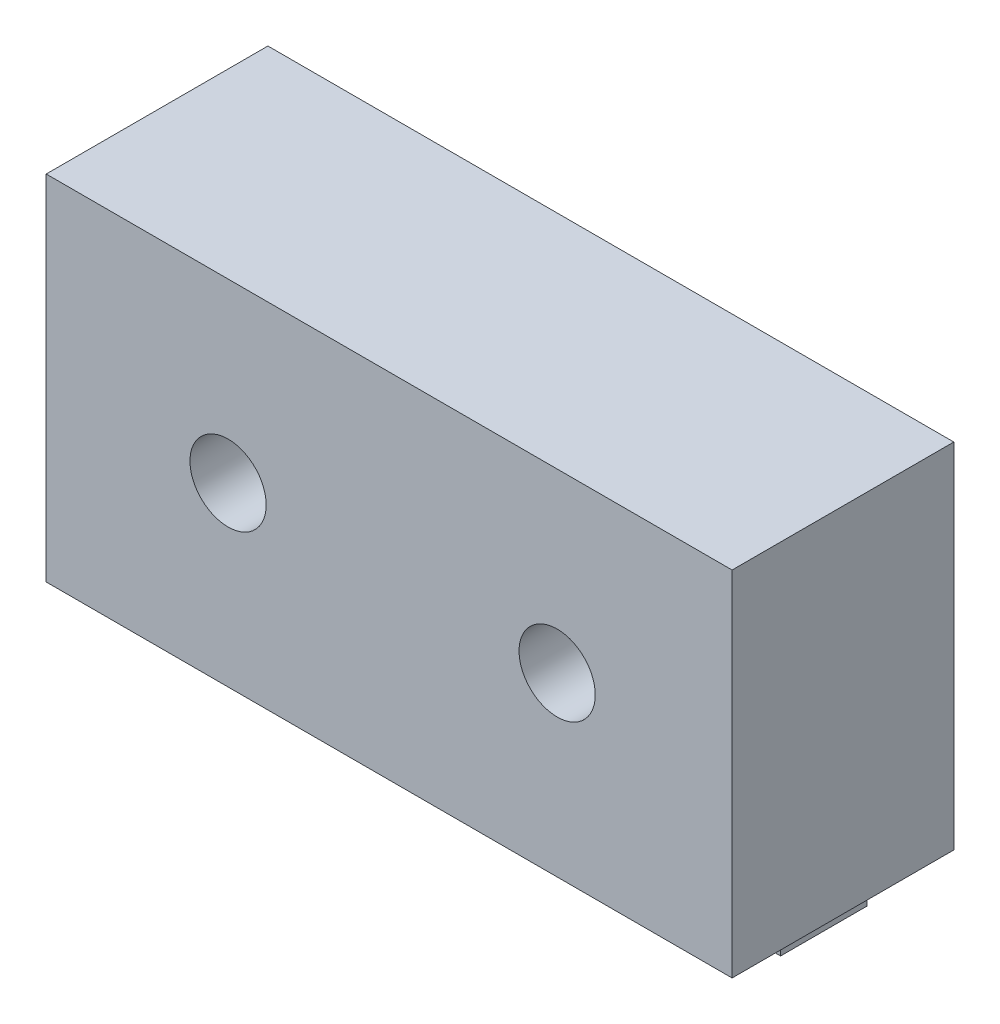
ISO-10303-21;
HEADER;
FILE_DESCRIPTION(('STEP AP214'),'2;1');
FILE_NAME('part.step','',(''),(''),'','','');
FILE_SCHEMA(('AUTOMOTIVE_DESIGN { 1 0 10303 214 1 1 1 1 }'));
ENDSEC;
DATA;
#1=APPLICATION_CONTEXT('core data for automotive mechanical design processes');
#2=APPLICATION_PROTOCOL_DEFINITION('international standard','automotive_design',2000,#1);
#3=PRODUCT_CONTEXT('',#1,'mechanical');
#4=PRODUCT('Part','Part','',(#3));
#5=PRODUCT_RELATED_PRODUCT_CATEGORY('part','',(#4));
#6=PRODUCT_DEFINITION_FORMATION('','',#4);
#7=PRODUCT_DEFINITION_CONTEXT('part definition',#1,'design');
#8=PRODUCT_DEFINITION('design','',#6,#7);
#9=PRODUCT_DEFINITION_SHAPE('','',#8);
#10=(LENGTH_UNIT() NAMED_UNIT(*) SI_UNIT(.MILLI.,.METRE.));
#11=(NAMED_UNIT(*) PLANE_ANGLE_UNIT() SI_UNIT($,.RADIAN.));
#12=(NAMED_UNIT(*) SI_UNIT($,.STERADIAN.) SOLID_ANGLE_UNIT());
#13=UNCERTAINTY_MEASURE_WITH_UNIT(LENGTH_MEASURE(1.E-05),#10,'distance_accuracy_value','');
#14=(GEOMETRIC_REPRESENTATION_CONTEXT(3) GLOBAL_UNCERTAINTY_ASSIGNED_CONTEXT((#13)) GLOBAL_UNIT_ASSIGNED_CONTEXT((#10,
#11,#12)) REPRESENTATION_CONTEXT('',''));
#15=CARTESIAN_POINT('',(0.,0.,0.));
#16=DIRECTION('',(0.,0.,1.));
#17=DIRECTION('',(1.,0.,0.));
#18=AXIS2_PLACEMENT_3D('',#15,#16,#17);
#19=CARTESIAN_POINT('',(-866.,160.7,20.));
#20=DIRECTION('',(1.,0.,0.));
#21=DIRECTION('',(0.,0.,-1.));
#22=AXIS2_PLACEMENT_3D('',#19,#20,#21);
#23=PLANE('',#22);
#24=DIRECTION('',(0.,-1.,0.));
#25=VECTOR('',#24,1.);
#26=CARTESIAN_POINT('',(-866.,160.7,13.6));
#27=LINE('',#26,#25);
#28=CARTESIAN_POINT('',(-866.,160.7,13.6));
#29=VERTEX_POINT('',#28);
#30=CARTESIAN_POINT('',(-866.,150.5,13.6));
#31=VERTEX_POINT('',#30);
#32=EDGE_CURVE('E153',#29,#31,#27,.T.);
#33=ORIENTED_EDGE('',*,*,#32,.T.);
#34=DIRECTION('',(0.,0.,-1.));
#35=VECTOR('',#34,1.);
#36=CARTESIAN_POINT('',(-866.,150.5,20.));
#37=LINE('',#36,#35);
#38=CARTESIAN_POINT('',(-866.,150.5,20.));
#39=VERTEX_POINT('',#38);
#40=EDGE_CURVE('E11',#39,#31,#37,.T.);
#41=ORIENTED_EDGE('',*,*,#40,.F.);
#42=DIRECTION('',(0.,-1.,0.));
#43=VECTOR('',#42,1.);
#44=CARTESIAN_POINT('',(-866.,160.7,20.));
#45=LINE('',#44,#43);
#46=CARTESIAN_POINT('',(-866.,160.7,20.));
#47=VERTEX_POINT('',#46);
#48=EDGE_CURVE('E152',#47,#39,#45,.T.);
#49=ORIENTED_EDGE('',*,*,#48,.F.);
#50=DIRECTION('',(0.,0.,-1.));
#51=VECTOR('',#50,1.);
#52=CARTESIAN_POINT('',(-866.,160.7,20.));
#53=LINE('',#52,#51);
#54=EDGE_CURVE('E159',#47,#29,#53,.T.);
#55=ORIENTED_EDGE('',*,*,#54,.T.);
#56=EDGE_LOOP('',(#33,#41,#49,#55));
#57=FACE_BOUND('',#56,.T.);
#58=ADVANCED_FACE('F41',(#57),#23,.F.);
#59=CARTESIAN_POINT('',(-866.,150.5,20.));
#60=DIRECTION('',(0.,1.,0.));
#61=DIRECTION('',(0.,0.,1.));
#62=AXIS2_PLACEMENT_3D('',#59,#60,#61);
#63=PLANE('',#62);
#64=DIRECTION('',(0.,0.,-1.));
#65=VECTOR('',#64,1.);
#66=CARTESIAN_POINT('',(-846.75,150.5,18.05));
#67=LINE('',#66,#65);
#68=CARTESIAN_POINT('',(-846.75,150.5,18.05));
#69=VERTEX_POINT('',#68);
#70=CARTESIAN_POINT('',(-846.75,150.5,15.55));
#71=VERTEX_POINT('',#70);
#72=EDGE_CURVE('E145',#69,#71,#67,.T.);
#73=ORIENTED_EDGE('',*,*,#72,.T.);
#74=DIRECTION('',(-1.,0.,0.));
#75=VECTOR('',#74,1.);
#76=CARTESIAN_POINT('',(-846.75,150.5,15.55));
#77=LINE('',#76,#75);
#78=CARTESIAN_POINT('',(-849.25,150.5,15.55));
#79=VERTEX_POINT('',#78);
#80=EDGE_CURVE('E60',#71,#79,#77,.T.);
#81=ORIENTED_EDGE('',*,*,#80,.T.);
#82=DIRECTION('',(0.,0.,-1.));
#83=VECTOR('',#82,1.);
#84=CARTESIAN_POINT('',(-849.25,150.5,18.05));
#85=LINE('',#84,#83);
#86=CARTESIAN_POINT('',(-849.25,150.5,18.05));
#87=VERTEX_POINT('',#86);
#88=EDGE_CURVE('E208',#87,#79,#85,.T.);
#89=ORIENTED_EDGE('',*,*,#88,.F.);
#90=DIRECTION('',(-1.,0.,0.));
#91=VECTOR('',#90,1.);
#92=CARTESIAN_POINT('',(-846.75,150.5,18.05));
#93=LINE('',#92,#91);
#94=EDGE_CURVE('E131',#69,#87,#93,.T.);
#95=ORIENTED_EDGE('',*,*,#94,.F.);
#96=EDGE_LOOP('',(#73,#81,#89,#95));
#97=FACE_BOUND('',#96,.T.);
#98=DIRECTION('',(1.,0.,0.));
#99=VECTOR('',#98,1.);
#100=CARTESIAN_POINT('',(-866.,150.5,13.6));
#101=LINE('',#100,#99);
#102=CARTESIAN_POINT('',(-846.2,150.5,13.6));
#103=VERTEX_POINT('',#102);
#104=EDGE_CURVE('E162',#31,#103,#101,.T.);
#105=ORIENTED_EDGE('',*,*,#104,.T.);
#106=DIRECTION('',(0.,0.,-1.));
#107=VECTOR('',#106,1.);
#108=CARTESIAN_POINT('',(-846.2,150.5,20.));
#109=LINE('',#108,#107);
#110=CARTESIAN_POINT('',(-846.2,150.5,20.));
#111=VERTEX_POINT('',#110);
#112=EDGE_CURVE('E47',#111,#103,#109,.T.);
#113=ORIENTED_EDGE('',*,*,#112,.F.);
#114=DIRECTION('',(1.,0.,0.));
#115=VECTOR('',#114,1.);
#116=CARTESIAN_POINT('',(-866.,150.5,20.));
#117=LINE('',#116,#115);
#118=EDGE_CURVE('E94',#39,#111,#117,.T.);
#119=ORIENTED_EDGE('',*,*,#118,.F.);
#120=ORIENTED_EDGE('',*,*,#40,.T.);
#121=EDGE_LOOP('',(#105,#113,#119,#120));
#122=FACE_BOUND('',#121,.T.);
#123=ADVANCED_FACE('F194',(#97,#122),#63,.F.);
#124=CARTESIAN_POINT('',(-846.2,150.5,20.));
#125=DIRECTION('',(-1.,0.,0.));
#126=DIRECTION('',(0.,0.,1.));
#127=AXIS2_PLACEMENT_3D('',#124,#125,#126);
#128=PLANE('',#127);
#129=DIRECTION('',(0.,1.,0.));
#130=VECTOR('',#129,1.);
#131=CARTESIAN_POINT('',(-846.2,150.5,13.6));
#132=LINE('',#131,#130);
#133=CARTESIAN_POINT('',(-846.2,160.7,13.6));
#134=VERTEX_POINT('',#133);
#135=EDGE_CURVE('E164',#103,#134,#132,.T.);
#136=ORIENTED_EDGE('',*,*,#135,.T.);
#137=DIRECTION('',(0.,0.,-1.));
#138=VECTOR('',#137,1.);
#139=CARTESIAN_POINT('',(-846.2,160.7,20.));
#140=LINE('',#139,#138);
#141=CARTESIAN_POINT('',(-846.2,160.7,20.));
#142=VERTEX_POINT('',#141);
#143=EDGE_CURVE('E166',#142,#134,#140,.T.);
#144=ORIENTED_EDGE('',*,*,#143,.F.);
#145=DIRECTION('',(0.,1.,0.));
#146=VECTOR('',#145,1.);
#147=CARTESIAN_POINT('',(-846.2,150.5,20.));
#148=LINE('',#147,#146);
#149=EDGE_CURVE('E160',#111,#142,#148,.T.);
#150=ORIENTED_EDGE('',*,*,#149,.F.);
#151=ORIENTED_EDGE('',*,*,#112,.T.);
#152=EDGE_LOOP('',(#136,#144,#150,#151));
#153=FACE_BOUND('',#152,.T.);
#154=ADVANCED_FACE('F173',(#153),#128,.F.);
#155=CARTESIAN_POINT('',(-846.2,160.7,20.));
#156=DIRECTION('',(0.,-1.,0.));
#157=DIRECTION('',(0.,0.,-1.));
#158=AXIS2_PLACEMENT_3D('',#155,#156,#157);
#159=PLANE('',#158);
#160=DIRECTION('',(-1.,0.,0.));
#161=VECTOR('',#160,1.);
#162=CARTESIAN_POINT('',(-846.2,160.7,13.6));
#163=LINE('',#162,#161);
#164=EDGE_CURVE('E87',#134,#29,#163,.T.);
#165=ORIENTED_EDGE('',*,*,#164,.T.);
#166=ORIENTED_EDGE('',*,*,#54,.F.);
#167=DIRECTION('',(-1.,0.,0.));
#168=VECTOR('',#167,1.);
#169=CARTESIAN_POINT('',(-846.2,160.7,20.));
#170=LINE('',#169,#168);
#171=EDGE_CURVE('E66',#142,#47,#170,.T.);
#172=ORIENTED_EDGE('',*,*,#171,.F.);
#173=ORIENTED_EDGE('',*,*,#143,.T.);
#174=EDGE_LOOP('',(#165,#166,#172,#173));
#175=FACE_BOUND('',#174,.T.);
#176=ADVANCED_FACE('F181',(#175),#159,.F.);
#177=CARTESIAN_POINT('',(0.,0.,20.));
#178=DIRECTION('',(0.,0.,1.));
#179=DIRECTION('',(1.,0.,0.));
#180=AXIS2_PLACEMENT_3D('',#177,#178,#179);
#181=PLANE('',#180);
#182=CARTESIAN_POINT('',(-860.75,155.6,20.));
#183=DIRECTION('',(0.,0.,1.));
#184=DIRECTION('',(1.,0.,0.));
#185=AXIS2_PLACEMENT_3D('',#182,#183,#184);
#186=CIRCLE('',#185,1.09999999999999);
#187=CARTESIAN_POINT('',(-859.65,155.6,20.));
#188=VERTEX_POINT('',#187);
#189=EDGE_CURVE('E147',#188,#188,#186,.T.);
#190=ORIENTED_EDGE('',*,*,#189,.F.);
#191=EDGE_LOOP('',(#190));
#192=FACE_BOUND('',#191,.T.);
#193=CARTESIAN_POINT('',(-851.25,155.6,20.));
#194=DIRECTION('',(0.,0.,1.));
#195=DIRECTION('',(1.,0.,0.));
#196=AXIS2_PLACEMENT_3D('',#193,#194,#195);
#197=CIRCLE('',#196,1.09999999999999);
#198=CARTESIAN_POINT('',(-850.15,155.6,20.));
#199=VERTEX_POINT('',#198);
#200=EDGE_CURVE('E141',#199,#199,#197,.T.);
#201=ORIENTED_EDGE('',*,*,#200,.F.);
#202=EDGE_LOOP('',(#201));
#203=FACE_BOUND('',#202,.T.);
#204=ORIENTED_EDGE('',*,*,#48,.T.);
#205=ORIENTED_EDGE('',*,*,#118,.T.);
#206=ORIENTED_EDGE('',*,*,#149,.T.);
#207=ORIENTED_EDGE('',*,*,#171,.T.);
#208=EDGE_LOOP('',(#204,#205,#206,#207));
#209=FACE_BOUND('',#208,.T.);
#210=ADVANCED_FACE('F183',(#192,#203,#209),#181,.T.);
#211=CARTESIAN_POINT('',(0.,0.,13.6));
#212=DIRECTION('',(0.,0.,1.));
#213=DIRECTION('',(1.,0.,0.));
#214=AXIS2_PLACEMENT_3D('',#211,#212,#213);
#215=PLANE('',#214);
#216=CARTESIAN_POINT('',(-860.75,155.6,13.6));
#217=DIRECTION('',(0.,0.,1.));
#218=DIRECTION('',(1.,0.,0.));
#219=AXIS2_PLACEMENT_3D('',#216,#217,#218);
#220=CIRCLE('',#219,1.09999999999999);
#221=CARTESIAN_POINT('',(-859.65,155.6,13.6));
#222=VERTEX_POINT('',#221);
#223=EDGE_CURVE('E42',#222,#222,#220,.T.);
#224=ORIENTED_EDGE('',*,*,#223,.T.);
#225=EDGE_LOOP('',(#224));
#226=FACE_BOUND('',#225,.T.);
#227=CARTESIAN_POINT('',(-851.25,155.6,13.6));
#228=DIRECTION('',(0.,0.,1.));
#229=DIRECTION('',(1.,0.,0.));
#230=AXIS2_PLACEMENT_3D('',#227,#228,#229);
#231=CIRCLE('',#230,1.09999999999999);
#232=CARTESIAN_POINT('',(-850.15,155.6,13.6));
#233=VERTEX_POINT('',#232);
#234=EDGE_CURVE('E140',#233,#233,#231,.T.);
#235=ORIENTED_EDGE('',*,*,#234,.T.);
#236=EDGE_LOOP('',(#235));
#237=FACE_BOUND('',#236,.T.);
#238=ORIENTED_EDGE('',*,*,#32,.F.);
#239=ORIENTED_EDGE('',*,*,#164,.F.);
#240=ORIENTED_EDGE('',*,*,#135,.F.);
#241=ORIENTED_EDGE('',*,*,#104,.F.);
#242=EDGE_LOOP('',(#238,#239,#240,#241));
#243=FACE_BOUND('',#242,.T.);
#244=ADVANCED_FACE('F178',(#226,#237,#243),#215,.F.);
#245=CARTESIAN_POINT('',(-851.25,155.6,-30.));
#246=DIRECTION('',(0.,0.,1.));
#247=DIRECTION('',(1.,0.,0.));
#248=AXIS2_PLACEMENT_3D('',#245,#246,#247);
#249=CYLINDRICAL_SURFACE('',#248,1.09999999999999);
#250=ORIENTED_EDGE('',*,*,#200,.T.);
#251=EDGE_LOOP('',(#250));
#252=FACE_BOUND('',#251,.T.);
#253=ORIENTED_EDGE('',*,*,#234,.F.);
#254=EDGE_LOOP('',(#253));
#255=FACE_BOUND('',#254,.T.);
#256=ADVANCED_FACE('F233',(#252,#255),#249,.F.);
#257=CARTESIAN_POINT('',(-860.75,155.6,-30.));
#258=DIRECTION('',(0.,0.,1.));
#259=DIRECTION('',(1.,0.,0.));
#260=AXIS2_PLACEMENT_3D('',#257,#258,#259);
#261=CYLINDRICAL_SURFACE('',#260,1.09999999999999);
#262=ORIENTED_EDGE('',*,*,#189,.T.);
#263=EDGE_LOOP('',(#262));
#264=FACE_BOUND('',#263,.T.);
#265=ORIENTED_EDGE('',*,*,#223,.F.);
#266=EDGE_LOOP('',(#265));
#267=FACE_BOUND('',#266,.T.);
#268=ADVANCED_FACE('F232',(#264,#267),#261,.F.);
#269=CARTESIAN_POINT('',(-849.25,150.5,18.05));
#270=DIRECTION('',(1.,0.,0.));
#271=DIRECTION('',(0.,0.,-1.));
#272=AXIS2_PLACEMENT_3D('',#269,#270,#271);
#273=PLANE('',#272);
#274=DIRECTION('',(0.,-1.,0.));
#275=VECTOR('',#274,1.);
#276=CARTESIAN_POINT('',(-849.25,150.5,15.55));
#277=LINE('',#276,#275);
#278=CARTESIAN_POINT('',(-849.25,149.8,15.55));
#279=VERTEX_POINT('',#278);
#280=EDGE_CURVE('E138',#79,#279,#277,.T.);
#281=ORIENTED_EDGE('',*,*,#280,.T.);
#282=DIRECTION('',(0.,0.,-1.));
#283=VECTOR('',#282,1.);
#284=CARTESIAN_POINT('',(-849.25,149.8,18.05));
#285=LINE('',#284,#283);
#286=CARTESIAN_POINT('',(-849.25,149.8,18.05));
#287=VERTEX_POINT('',#286);
#288=EDGE_CURVE('E122',#287,#279,#285,.T.);
#289=ORIENTED_EDGE('',*,*,#288,.F.);
#290=DIRECTION('',(0.,-1.,0.));
#291=VECTOR('',#290,1.);
#292=CARTESIAN_POINT('',(-849.25,150.5,18.05));
#293=LINE('',#292,#291);
#294=EDGE_CURVE('E129',#87,#287,#293,.T.);
#295=ORIENTED_EDGE('',*,*,#294,.F.);
#296=ORIENTED_EDGE('',*,*,#88,.T.);
#297=EDGE_LOOP('',(#281,#289,#295,#296));
#298=FACE_BOUND('',#297,.T.);
#299=ADVANCED_FACE('F139',(#298),#273,.F.);
#300=CARTESIAN_POINT('',(-849.25,149.8,18.05));
#301=DIRECTION('',(0.,1.,0.));
#302=DIRECTION('',(0.,0.,1.));
#303=AXIS2_PLACEMENT_3D('',#300,#301,#302);
#304=PLANE('',#303);
#305=DIRECTION('',(1.,0.,0.));
#306=VECTOR('',#305,1.);
#307=CARTESIAN_POINT('',(-849.25,149.8,15.55));
#308=LINE('',#307,#306);
#309=CARTESIAN_POINT('',(-846.75,149.8,15.55));
#310=VERTEX_POINT('',#309);
#311=EDGE_CURVE('E212',#279,#310,#308,.T.);
#312=ORIENTED_EDGE('',*,*,#311,.T.);
#313=DIRECTION('',(0.,0.,-1.));
#314=VECTOR('',#313,1.);
#315=CARTESIAN_POINT('',(-846.75,149.8,18.05));
#316=LINE('',#315,#314);
#317=CARTESIAN_POINT('',(-846.75,149.8,18.05));
#318=VERTEX_POINT('',#317);
#319=EDGE_CURVE('E125',#318,#310,#316,.T.);
#320=ORIENTED_EDGE('',*,*,#319,.F.);
#321=DIRECTION('',(1.,0.,0.));
#322=VECTOR('',#321,1.);
#323=CARTESIAN_POINT('',(-849.25,149.8,18.05));
#324=LINE('',#323,#322);
#325=EDGE_CURVE('E120',#287,#318,#324,.T.);
#326=ORIENTED_EDGE('',*,*,#325,.F.);
#327=ORIENTED_EDGE('',*,*,#288,.T.);
#328=EDGE_LOOP('',(#312,#320,#326,#327));
#329=FACE_BOUND('',#328,.T.);
#330=ADVANCED_FACE('F118',(#329),#304,.F.);
#331=CARTESIAN_POINT('',(-846.75,149.8,18.05));
#332=DIRECTION('',(-1.,0.,0.));
#333=DIRECTION('',(0.,0.,1.));
#334=AXIS2_PLACEMENT_3D('',#331,#332,#333);
#335=PLANE('',#334);
#336=DIRECTION('',(0.,1.,0.));
#337=VECTOR('',#336,1.);
#338=CARTESIAN_POINT('',(-846.75,149.8,15.55));
#339=LINE('',#338,#337);
#340=EDGE_CURVE('E215',#310,#71,#339,.T.);
#341=ORIENTED_EDGE('',*,*,#340,.T.);
#342=ORIENTED_EDGE('',*,*,#72,.F.);
#343=DIRECTION('',(0.,1.,0.));
#344=VECTOR('',#343,1.);
#345=CARTESIAN_POINT('',(-846.75,149.8,18.05));
#346=LINE('',#345,#344);
#347=EDGE_CURVE('E126',#318,#69,#346,.T.);
#348=ORIENTED_EDGE('',*,*,#347,.F.);
#349=ORIENTED_EDGE('',*,*,#319,.T.);
#350=EDGE_LOOP('',(#341,#342,#348,#349));
#351=FACE_BOUND('',#350,.T.);
#352=ADVANCED_FACE('F217',(#351),#335,.F.);
#353=CARTESIAN_POINT('',(0.,0.,18.05));
#354=DIRECTION('',(0.,0.,1.));
#355=DIRECTION('',(1.,0.,0.));
#356=AXIS2_PLACEMENT_3D('',#353,#354,#355);
#357=PLANE('',#356);
#358=ORIENTED_EDGE('',*,*,#294,.T.);
#359=ORIENTED_EDGE('',*,*,#325,.T.);
#360=ORIENTED_EDGE('',*,*,#347,.T.);
#361=ORIENTED_EDGE('',*,*,#94,.T.);
#362=EDGE_LOOP('',(#358,#359,#360,#361));
#363=FACE_BOUND('',#362,.T.);
#364=ADVANCED_FACE('F134',(#363),#357,.T.);
#365=CARTESIAN_POINT('',(0.,0.,15.55));
#366=DIRECTION('',(0.,0.,1.));
#367=DIRECTION('',(1.,0.,0.));
#368=AXIS2_PLACEMENT_3D('',#365,#366,#367);
#369=PLANE('',#368);
#370=ORIENTED_EDGE('',*,*,#280,.F.);
#371=ORIENTED_EDGE('',*,*,#80,.F.);
#372=ORIENTED_EDGE('',*,*,#340,.F.);
#373=ORIENTED_EDGE('',*,*,#311,.F.);
#374=EDGE_LOOP('',(#370,#371,#372,#373));
#375=FACE_BOUND('',#374,.T.);
#376=ADVANCED_FACE('F218',(#375),#369,.F.);
#377=CLOSED_SHELL('',(#58,#123,#154,#176,#210,#244,#256,#268,#299,#330,#352,#364,#376));
#378=MANIFOLD_SOLID_BREP('B2',#377);
#379=ADVANCED_BREP_SHAPE_REPRESENTATION('',(#18,#378),#14);
#380=SHAPE_DEFINITION_REPRESENTATION(#9,#379);
ENDSEC;
END-ISO-10303-21;
